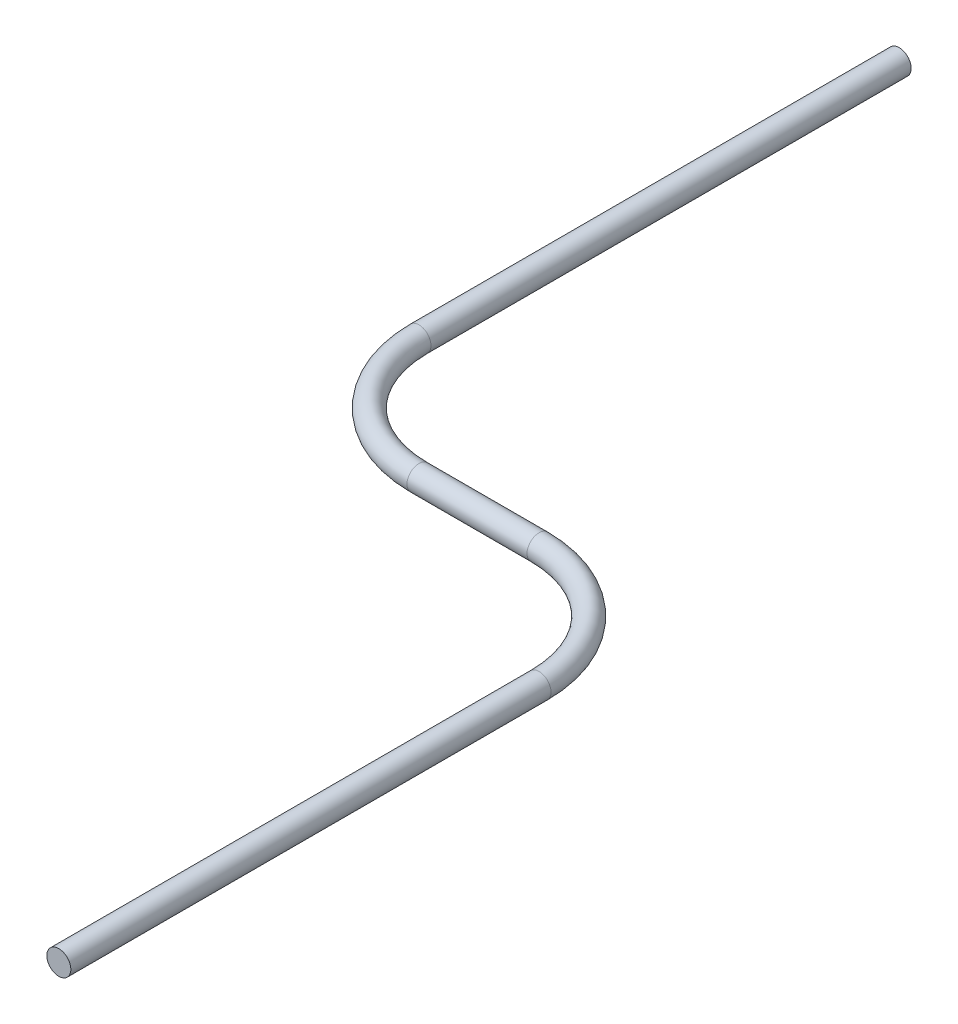
ISO-10303-21;
HEADER;
FILE_DESCRIPTION(('STEP AP214'),'2;1');
FILE_NAME('part.step','',(''),(''),'','','');
FILE_SCHEMA(('AUTOMOTIVE_DESIGN { 1 0 10303 214 1 1 1 1 }'));
ENDSEC;
DATA;
#1=APPLICATION_CONTEXT('core data for automotive mechanical design processes');
#2=APPLICATION_PROTOCOL_DEFINITION('international standard','automotive_design',2000,#1);
#3=PRODUCT_CONTEXT('',#1,'mechanical');
#4=PRODUCT('Part','Part','',(#3));
#5=PRODUCT_RELATED_PRODUCT_CATEGORY('part','',(#4));
#6=PRODUCT_DEFINITION_FORMATION('','',#4);
#7=PRODUCT_DEFINITION_CONTEXT('part definition',#1,'design');
#8=PRODUCT_DEFINITION('design','',#6,#7);
#9=PRODUCT_DEFINITION_SHAPE('','',#8);
#10=(LENGTH_UNIT() NAMED_UNIT(*) SI_UNIT(.MILLI.,.METRE.));
#11=(NAMED_UNIT(*) PLANE_ANGLE_UNIT() SI_UNIT($,.RADIAN.));
#12=(NAMED_UNIT(*) SI_UNIT($,.STERADIAN.) SOLID_ANGLE_UNIT());
#13=UNCERTAINTY_MEASURE_WITH_UNIT(LENGTH_MEASURE(1.E-05),#10,'distance_accuracy_value','');
#14=(GEOMETRIC_REPRESENTATION_CONTEXT(3) GLOBAL_UNCERTAINTY_ASSIGNED_CONTEXT((#13)) GLOBAL_UNIT_ASSIGNED_CONTEXT((#10,
#11,#12)) REPRESENTATION_CONTEXT('',''));
#15=CARTESIAN_POINT('',(0.,0.,0.));
#16=DIRECTION('',(0.,0.,1.));
#17=DIRECTION('',(1.,0.,0.));
#18=AXIS2_PLACEMENT_3D('',#15,#16,#17);
#19=CARTESIAN_POINT('',(0.,0.,0.));
#20=DIRECTION('',(0.,0.,1.));
#21=DIRECTION('',(1.,0.,0.));
#22=AXIS2_PLACEMENT_3D('',#19,#20,#21);
#23=PLANE('',#22);
#24=CARTESIAN_POINT('',(0.,0.,0.));
#25=DIRECTION('',(0.,0.,1.));
#26=DIRECTION('',(1.,0.,0.));
#27=AXIS2_PLACEMENT_3D('',#24,#25,#26);
#28=CIRCLE('',#27,1.);
#29=CARTESIAN_POINT('',(1.,0.,0.));
#30=VERTEX_POINT('',#29);
#31=EDGE_CURVE('E64',#30,#30,#28,.T.);
#32=ORIENTED_EDGE('',*,*,#31,.F.);
#33=EDGE_LOOP('',(#32));
#34=FACE_BOUND('',#33,.T.);
#35=ADVANCED_FACE('F42',(#34),#23,.F.);
#36=CARTESIAN_POINT('',(30.,0.,100.));
#37=DIRECTION('',(0.,0.,1.));
#38=DIRECTION('',(1.,0.,0.));
#39=AXIS2_PLACEMENT_3D('',#36,#37,#38);
#40=PLANE('',#39);
#41=CARTESIAN_POINT('',(30.,0.,100.));
#42=DIRECTION('',(0.,0.,1.));
#43=DIRECTION('',(1.,0.,0.));
#44=AXIS2_PLACEMENT_3D('',#41,#42,#43);
#45=CIRCLE('',#44,1.);
#46=CARTESIAN_POINT('',(31.,0.,100.));
#47=VERTEX_POINT('',#46);
#48=EDGE_CURVE('E12',#47,#47,#45,.T.);
#49=ORIENTED_EDGE('',*,*,#48,.T.);
#50=EDGE_LOOP('',(#49));
#51=FACE_BOUND('',#50,.T.);
#52=ADVANCED_FACE('F71',(#51),#40,.T.);
#53=CARTESIAN_POINT('',(0.,0.,0.));
#54=DIRECTION('',(0.,0.,1.));
#55=DIRECTION('',(1.,0.,0.));
#56=AXIS2_PLACEMENT_3D('',#53,#54,#55);
#57=CYLINDRICAL_SURFACE('',#56,1.);
#58=CARTESIAN_POINT('',(0.,0.,39.9999999999999));
#59=DIRECTION('',(0.,0.,1.));
#60=DIRECTION('',(1.,0.,0.));
#61=AXIS2_PLACEMENT_3D('',#58,#59,#60);
#62=CIRCLE('',#61,1.);
#63=CARTESIAN_POINT('',(-0.999999999999997,0.,39.9999999999999));
#64=VERTEX_POINT('',#63);
#65=EDGE_CURVE('E61',#64,#64,#62,.T.);
#66=ORIENTED_EDGE('',*,*,#65,.F.);
#67=EDGE_LOOP('',(#66));
#68=FACE_BOUND('',#67,.T.);
#69=ORIENTED_EDGE('',*,*,#31,.T.);
#70=EDGE_LOOP('',(#69));
#71=FACE_BOUND('',#70,.T.);
#72=ADVANCED_FACE('F68',(#68,#71),#57,.T.);
#73=CARTESIAN_POINT('',(10.,0.,40.));
#74=DIRECTION('',(0.,1.,0.));
#75=DIRECTION('',(0.,0.,1.));
#76=AXIS2_PLACEMENT_3D('',#73,#74,#75);
#77=TOROIDAL_SURFACE('',#76,10.,1.);
#78=CARTESIAN_POINT('',(10.,0.,50.));
#79=DIRECTION('',(1.,0.,0.));
#80=DIRECTION('',(0.,0.,-1.));
#81=AXIS2_PLACEMENT_3D('',#78,#79,#80);
#82=CIRCLE('',#81,1.);
#83=CARTESIAN_POINT('',(10.,0.,51.));
#84=VERTEX_POINT('',#83);
#85=EDGE_CURVE('E56',#84,#84,#82,.T.);
#86=CARTESIAN_POINT('',(10.,0.,40.));
#87=DIRECTION('',(0.,1.,0.));
#88=DIRECTION('',(0.,0.,1.));
#89=AXIS2_PLACEMENT_3D('',#86,#87,#88);
#90=CIRCLE('',#89,11.);
#91=EDGE_CURVE('',#64,#84,#90,.T.);
#92=ORIENTED_EDGE('',*,*,#65,.T.);
#93=ORIENTED_EDGE('',*,*,#85,.F.);
#94=ORIENTED_EDGE('',*,*,#91,.T.);
#95=ORIENTED_EDGE('',*,*,#91,.F.);
#96=EDGE_LOOP('',(#92,#94,#93,#95));
#97=FACE_BOUND('',#96,.T.);
#98=ADVANCED_FACE('F89',(#97),#77,.T.);
#99=CARTESIAN_POINT('',(10.,0.,50.));
#100=DIRECTION('',(1.,0.,0.));
#101=DIRECTION('',(0.,0.,-1.));
#102=AXIS2_PLACEMENT_3D('',#99,#100,#101);
#103=CYLINDRICAL_SURFACE('',#102,1.);
#104=CARTESIAN_POINT('',(19.9999999999999,0.,50.));
#105=DIRECTION('',(1.,0.,0.));
#106=DIRECTION('',(0.,0.,-1.));
#107=AXIS2_PLACEMENT_3D('',#104,#105,#106);
#108=CIRCLE('',#107,1.);
#109=CARTESIAN_POINT('',(19.9999999999999,0.,49.));
#110=VERTEX_POINT('',#109);
#111=EDGE_CURVE('E52',#110,#110,#108,.T.);
#112=ORIENTED_EDGE('',*,*,#111,.F.);
#113=EDGE_LOOP('',(#112));
#114=FACE_BOUND('',#113,.T.);
#115=ORIENTED_EDGE('',*,*,#85,.T.);
#116=EDGE_LOOP('',(#115));
#117=FACE_BOUND('',#116,.T.);
#118=ADVANCED_FACE('F83',(#114,#117),#103,.T.);
#119=CARTESIAN_POINT('',(20.,0.,60.));
#120=DIRECTION('',(0.,-1.,0.));
#121=DIRECTION('',(0.,0.,-1.));
#122=AXIS2_PLACEMENT_3D('',#119,#120,#121);
#123=TOROIDAL_SURFACE('',#122,10.,1.);
#124=CARTESIAN_POINT('',(30.,0.,60.0000000000001));
#125=DIRECTION('',(0.,0.,1.));
#126=DIRECTION('',(1.,0.,0.));
#127=AXIS2_PLACEMENT_3D('',#124,#125,#126);
#128=CIRCLE('',#127,1.);
#129=CARTESIAN_POINT('',(31.,0.,60.0000000000001));
#130=VERTEX_POINT('',#129);
#131=EDGE_CURVE('E48',#130,#130,#128,.T.);
#132=CARTESIAN_POINT('',(20.,0.,60.));
#133=DIRECTION('',(0.,-1.,0.));
#134=DIRECTION('',(0.,0.,-1.));
#135=AXIS2_PLACEMENT_3D('',#132,#133,#134);
#136=CIRCLE('',#135,11.);
#137=EDGE_CURVE('',#110,#130,#136,.T.);
#138=ORIENTED_EDGE('',*,*,#111,.T.);
#139=ORIENTED_EDGE('',*,*,#131,.F.);
#140=ORIENTED_EDGE('',*,*,#137,.T.);
#141=ORIENTED_EDGE('',*,*,#137,.F.);
#142=EDGE_LOOP('',(#138,#140,#139,#141));
#143=FACE_BOUND('',#142,.T.);
#144=ADVANCED_FACE('F77',(#143),#123,.T.);
#145=CARTESIAN_POINT('',(30.,0.,60.0000000000001));
#146=DIRECTION('',(0.,0.,1.));
#147=DIRECTION('',(1.,0.,0.));
#148=AXIS2_PLACEMENT_3D('',#145,#146,#147);
#149=CYLINDRICAL_SURFACE('',#148,1.);
#150=ORIENTED_EDGE('',*,*,#48,.F.);
#151=EDGE_LOOP('',(#150));
#152=FACE_BOUND('',#151,.T.);
#153=ORIENTED_EDGE('',*,*,#131,.T.);
#154=EDGE_LOOP('',(#153));
#155=FACE_BOUND('',#154,.T.);
#156=ADVANCED_FACE('F75',(#152,#155),#149,.T.);
#157=CLOSED_SHELL('',(#35,#52,#72,#98,#118,#144,#156));
#158=MANIFOLD_SOLID_BREP('B2',#157);
#159=ADVANCED_BREP_SHAPE_REPRESENTATION('',(#18,#158),#14);
#160=SHAPE_DEFINITION_REPRESENTATION(#9,#159);
ENDSEC;
END-ISO-10303-21;
